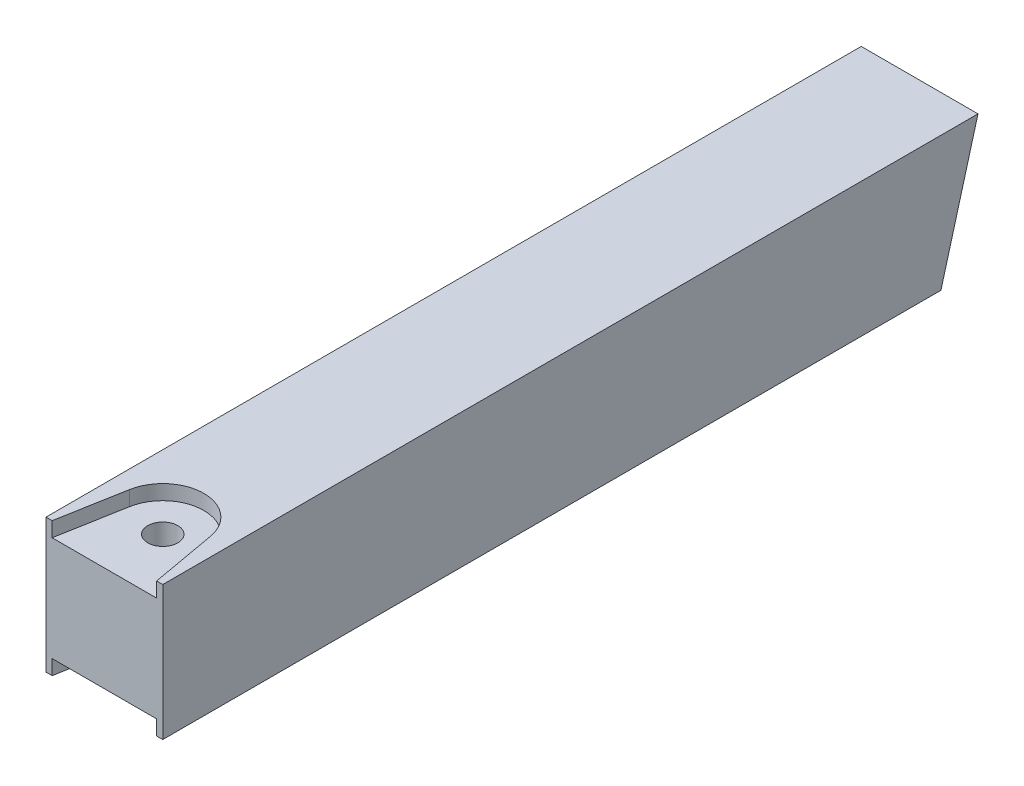
ISO-10303-21;
HEADER;
FILE_DESCRIPTION(('STEP AP214'),'2;1');
FILE_NAME('part.step','',(''),(''),'','','');
FILE_SCHEMA(('AUTOMOTIVE_DESIGN { 1 0 10303 214 1 1 1 1 }'));
ENDSEC;
DATA;
#1=APPLICATION_CONTEXT('core data for automotive mechanical design processes');
#2=APPLICATION_PROTOCOL_DEFINITION('international standard','automotive_design',2000,#1);
#3=PRODUCT_CONTEXT('',#1,'mechanical');
#4=PRODUCT('Part','Part','',(#3));
#5=PRODUCT_RELATED_PRODUCT_CATEGORY('part','',(#4));
#6=PRODUCT_DEFINITION_FORMATION('','',#4);
#7=PRODUCT_DEFINITION_CONTEXT('part definition',#1,'design');
#8=PRODUCT_DEFINITION('design','',#6,#7);
#9=PRODUCT_DEFINITION_SHAPE('','',#8);
#10=(LENGTH_UNIT() NAMED_UNIT(*) SI_UNIT(.MILLI.,.METRE.));
#11=(NAMED_UNIT(*) PLANE_ANGLE_UNIT() SI_UNIT($,.RADIAN.));
#12=(NAMED_UNIT(*) SI_UNIT($,.STERADIAN.) SOLID_ANGLE_UNIT());
#13=UNCERTAINTY_MEASURE_WITH_UNIT(LENGTH_MEASURE(1.E-05),#10,'distance_accuracy_value','');
#14=(GEOMETRIC_REPRESENTATION_CONTEXT(3) GLOBAL_UNCERTAINTY_ASSIGNED_CONTEXT((#13)) GLOBAL_UNIT_ASSIGNED_CONTEXT((#10,
#11,#12)) REPRESENTATION_CONTEXT('',''));
#15=CARTESIAN_POINT('',(0.,0.,0.));
#16=DIRECTION('',(0.,0.,1.));
#17=DIRECTION('',(1.,0.,0.));
#18=AXIS2_PLACEMENT_3D('',#15,#16,#17);
#19=CARTESIAN_POINT('',(0.,14.605,0.));
#20=DIRECTION('',(0.,-1.,0.));
#21=DIRECTION('',(0.,0.,-1.));
#22=AXIS2_PLACEMENT_3D('',#19,#20,#21);
#23=CYLINDRICAL_SURFACE('',#22,3.2639);
#24=CARTESIAN_POINT('',(0.,-11.3792,0.));
#25=DIRECTION('',(0.,1.,0.));
#26=DIRECTION('',(0.,0.,1.));
#27=AXIS2_PLACEMENT_3D('',#24,#25,#26);
#28=CIRCLE('',#27,3.2639);
#29=CARTESIAN_POINT('',(0.,-11.3792,-3.2639));
#30=VERTEX_POINT('',#29);
#31=EDGE_CURVE('E168',#30,#30,#28,.F.);
#32=CARTESIAN_POINT('',(0.,11.3792,0.));
#33=DIRECTION('',(0.,1.,0.));
#34=DIRECTION('',(0.,0.,1.));
#35=AXIS2_PLACEMENT_3D('',#32,#33,#34);
#36=CIRCLE('',#35,3.2639);
#37=CARTESIAN_POINT('',(0.,11.3792,-3.2639));
#38=VERTEX_POINT('',#37);
#39=EDGE_CURVE('E155',#38,#38,#36,.F.);
#40=CARTESIAN_POINT('',(0.,-11.3792,-3.2639));
#41=CARTESIAN_POINT('',(0.,-11.1421333333333,-3.2639));
#42=CARTESIAN_POINT('',(0.,-10.9050666666667,-3.2639));
#43=CARTESIAN_POINT('',(0.,-10.4309333333333,-3.2639));
#44=CARTESIAN_POINT('',(0.,-10.1938666666667,-3.2639));
#45=CARTESIAN_POINT('',(0.,-9.71973333333334,-3.2639));
#46=CARTESIAN_POINT('',(0.,-9.48266666666667,-3.2639));
#47=CARTESIAN_POINT('',(0.,-9.00853333333334,-3.2639));
#48=CARTESIAN_POINT('',(0.,-8.77146666666667,-3.2639));
#49=CARTESIAN_POINT('',(0.,-8.29733333333334,-3.2639));
#50=CARTESIAN_POINT('',(0.,-8.06026666666667,-3.2639));
#51=CARTESIAN_POINT('',(0.,-7.58613333333334,-3.2639));
#52=CARTESIAN_POINT('',(0.,-7.34906666666667,-3.2639));
#53=CARTESIAN_POINT('',(0.,-6.87493333333334,-3.2639));
#54=CARTESIAN_POINT('',(0.,-6.63786666666667,-3.2639));
#55=CARTESIAN_POINT('',(0.,-6.16373333333333,-3.2639));
#56=CARTESIAN_POINT('',(0.,-5.92666666666667,-3.2639));
#57=CARTESIAN_POINT('',(0.,-5.45253333333333,-3.2639));
#58=CARTESIAN_POINT('',(0.,-5.21546666666667,-3.2639));
#59=CARTESIAN_POINT('',(0.,-4.74133333333333,-3.2639));
#60=CARTESIAN_POINT('',(0.,-4.50426666666667,-3.2639));
#61=CARTESIAN_POINT('',(0.,-4.03013333333333,-3.2639));
#62=CARTESIAN_POINT('',(0.,-3.79306666666667,-3.2639));
#63=CARTESIAN_POINT('',(0.,-3.31893333333333,-3.2639));
#64=CARTESIAN_POINT('',(0.,-3.08186666666667,-3.2639));
#65=CARTESIAN_POINT('',(0.,-2.60773333333334,-3.2639));
#66=CARTESIAN_POINT('',(0.,-2.37066666666667,-3.2639));
#67=CARTESIAN_POINT('',(0.,-1.89653333333334,-3.2639));
#68=CARTESIAN_POINT('',(0.,-1.65946666666667,-3.2639));
#69=CARTESIAN_POINT('',(0.,-1.18533333333333,-3.2639));
#70=CARTESIAN_POINT('',(0.,-0.948266666666668,-3.2639));
#71=CARTESIAN_POINT('',(0.,-0.474133333333335,-3.2639));
#72=CARTESIAN_POINT('',(0.,-0.237066666666668,-3.2639));
#73=CARTESIAN_POINT('',(0.,0.237066666666665,-3.2639));
#74=CARTESIAN_POINT('',(0.,0.474133333333332,-3.2639));
#75=CARTESIAN_POINT('',(0.,0.948266666666665,-3.2639));
#76=CARTESIAN_POINT('',(0.,1.18533333333333,-3.2639));
#77=CARTESIAN_POINT('',(0.,1.65946666666667,-3.2639));
#78=CARTESIAN_POINT('',(0.,1.89653333333333,-3.2639));
#79=CARTESIAN_POINT('',(0.,2.37066666666667,-3.2639));
#80=CARTESIAN_POINT('',(0.,2.60773333333333,-3.2639));
#81=CARTESIAN_POINT('',(0.,3.08186666666667,-3.2639));
#82=CARTESIAN_POINT('',(0.,3.31893333333333,-3.2639));
#83=CARTESIAN_POINT('',(0.,3.79306666666667,-3.2639));
#84=CARTESIAN_POINT('',(0.,4.03013333333333,-3.2639));
#85=CARTESIAN_POINT('',(0.,4.50426666666667,-3.2639));
#86=CARTESIAN_POINT('',(0.,4.74133333333333,-3.2639));
#87=CARTESIAN_POINT('',(0.,5.21546666666667,-3.2639));
#88=CARTESIAN_POINT('',(0.,5.45253333333333,-3.2639));
#89=CARTESIAN_POINT('',(0.,5.92666666666666,-3.2639));
#90=CARTESIAN_POINT('',(0.,6.16373333333333,-3.2639));
#91=CARTESIAN_POINT('',(0.,6.63786666666667,-3.2639));
#92=CARTESIAN_POINT('',(0.,6.87493333333333,-3.2639));
#93=CARTESIAN_POINT('',(0.,7.34906666666666,-3.2639));
#94=CARTESIAN_POINT('',(0.,7.58613333333333,-3.2639));
#95=CARTESIAN_POINT('',(0.,8.06026666666667,-3.2639));
#96=CARTESIAN_POINT('',(0.,8.29733333333333,-3.2639));
#97=CARTESIAN_POINT('',(0.,8.77146666666667,-3.2639));
#98=CARTESIAN_POINT('',(0.,9.00853333333333,-3.2639));
#99=CARTESIAN_POINT('',(0.,9.48266666666667,-3.2639));
#100=CARTESIAN_POINT('',(0.,9.71973333333333,-3.2639));
#101=CARTESIAN_POINT('',(0.,10.1938666666667,-3.2639));
#102=CARTESIAN_POINT('',(0.,10.4309333333333,-3.2639));
#103=CARTESIAN_POINT('',(0.,10.9050666666667,-3.2639));
#104=CARTESIAN_POINT('',(0.,11.1421333333333,-3.2639));
#105=CARTESIAN_POINT('',(0.,11.3792,-3.2639));
#106=B_SPLINE_CURVE_WITH_KNOTS('',3,(#40,#41,#42,#43,#44,#45,#46,#47,#48,#49,#50,#51,#52,#53,
#54,#55,#56,#57,#58,#59,#60,#61,#62,#63,#64,#65,#66,#67,#68,#69,#70,#71,#72,#73,#74,#75,#76,#77,
#78,#79,#80,#81,#82,#83,#84,#85,#86,#87,#88,#89,#90,#91,#92,#93,#94,#95,#96,#97,#98,#99,#100,
#101,#102,#103,#104,#105),.UNSPECIFIED.,.F.,.F.,(4,2,2,2,2,2,2,2,2,2,2,2,2,2,2,2,2,2,2,2,2,2,2,
2,2,2,2,2,2,2,2,2,4),(0.,0.711199999999999,1.4224,2.1336,2.8448,3.556,4.2672,4.9784,5.6896,
6.4008,7.112,7.8232,8.5344,9.2456,9.9568,10.668,11.3792,12.0904,12.8016,13.5128,14.224,14.9352,
15.6464,16.3576,17.0688,17.78,18.4912,19.2024,19.9136,20.6248,21.336,22.0472,22.7584),.UNSPECIFIED.);
#107=EDGE_CURVE('BSEAM41',#30,#38,#106,.T.);
#108=ORIENTED_EDGE('',*,*,#31,.T.);
#109=ORIENTED_EDGE('',*,*,#39,.F.);
#110=ORIENTED_EDGE('',*,*,#107,.T.);
#111=ORIENTED_EDGE('',*,*,#107,.F.);
#112=EDGE_LOOP('',(#108,#110,#109,#111));
#113=FACE_BOUND('',#112,.T.);
#114=ADVANCED_FACE('F41',(#113),#23,.F.);
#115=CARTESIAN_POINT('',(-12.7,-14.605,-200.03366515423));
#116=DIRECTION('',(0.,-1.,0.));
#117=DIRECTION('',(0.,0.,-1.));
#118=AXIS2_PLACEMENT_3D('',#115,#116,#117);
#119=PLANE('',#118);
#120=CARTESIAN_POINT('',(0.,-14.605,0.));
#121=DIRECTION('',(0.,-1.,0.));
#122=DIRECTION('',(0.,0.,-1.));
#123=AXIS2_PLACEMENT_3D('',#120,#121,#122);
#124=CIRCLE('',#123,8.9408);
#125=CARTESIAN_POINT('',(-8.7999993450147,-14.605,-1.58047972708946));
#126=VERTEX_POINT('',#125);
#127=CARTESIAN_POINT('',(8.7999993450147,-14.605,-1.58047972708946));
#128=VERTEX_POINT('',#127);
#129=EDGE_CURVE('E235',#126,#128,#124,.T.);
#130=ORIENTED_EDGE('',*,*,#129,.F.);
#131=DIRECTION('',(-0.176771623019133,0.,0.984251895245918));
#132=VECTOR('',#131,1.);
#133=CARTESIAN_POINT('',(25.6065667525787,-14.605,-193.153806441383));
#134=LINE('',#133,#132);
#135=CARTESIAN_POINT('',(-11.3647732520222,-14.605,12.7));
#136=VERTEX_POINT('',#135);
#137=EDGE_CURVE('E177',#126,#136,#134,.T.);
#138=ORIENTED_EDGE('',*,*,#137,.T.);
#139=DIRECTION('',(1.,0.,0.));
#140=VECTOR('',#139,1.);
#141=CARTESIAN_POINT('',(-12.7,-14.605,12.7));
#142=LINE('',#141,#140);
#143=CARTESIAN_POINT('',(-12.7,-14.605,12.7));
#144=VERTEX_POINT('',#143);
#145=EDGE_CURVE('E203',#144,#136,#142,.T.);
#146=ORIENTED_EDGE('',*,*,#145,.F.);
#147=DIRECTION('',(0.,0.,1.));
#148=VECTOR('',#147,1.);
#149=CARTESIAN_POINT('',(-12.7,-14.605,-200.03366515423));
#150=LINE('',#149,#148);
#151=CARTESIAN_POINT('',(-12.7,-14.605,-156.56858645989));
#152=VERTEX_POINT('',#151);
#153=EDGE_CURVE('E218',#152,#144,#150,.T.);
#154=ORIENTED_EDGE('',*,*,#153,.F.);
#155=DIRECTION('',(1.,0.,0.));
#156=VECTOR('',#155,1.);
#157=CARTESIAN_POINT('',(-12.7,-14.605,-156.56858645989));
#158=LINE('',#157,#156);
#159=CARTESIAN_POINT('',(12.7,-14.605,-156.56858645989));
#160=VERTEX_POINT('',#159);
#161=EDGE_CURVE('E215',#152,#160,#158,.T.);
#162=ORIENTED_EDGE('',*,*,#161,.T.);
#163=DIRECTION('',(0.,0.,1.));
#164=VECTOR('',#163,1.);
#165=CARTESIAN_POINT('',(12.7,-14.605,-200.03366515423));
#166=LINE('',#165,#164);
#167=CARTESIAN_POINT('',(12.7,-14.605,12.7));
#168=VERTEX_POINT('',#167);
#169=EDGE_CURVE('E214',#160,#168,#166,.T.);
#170=ORIENTED_EDGE('',*,*,#169,.T.);
#171=CARTESIAN_POINT('',(11.3647732520222,-14.605,12.7));
#172=VERTEX_POINT('',#171);
#173=EDGE_CURVE('E202',#172,#168,#142,.T.);
#174=ORIENTED_EDGE('',*,*,#173,.F.);
#175=DIRECTION('',(0.176771623019133,0.,0.984251895245918));
#176=VECTOR('',#175,1.);
#177=CARTESIAN_POINT('',(-26.4002712028811,-14.605,-197.573096687933));
#178=LINE('',#177,#176);
#179=EDGE_CURVE('E175',#128,#172,#178,.T.);
#180=ORIENTED_EDGE('',*,*,#179,.F.);
#181=EDGE_LOOP('',(#130,#138,#146,#154,#162,#170,#174,#180));
#182=FACE_BOUND('',#181,.T.);
#183=ADVANCED_FACE('F263',(#182),#119,.T.);
#184=CARTESIAN_POINT('',(0.,0.,12.7));
#185=DIRECTION('',(0.,0.,-1.));
#186=DIRECTION('',(-1.,0.,0.));
#187=AXIS2_PLACEMENT_3D('',#184,#185,#186);
#188=PLANE('',#187);
#189=DIRECTION('',(1.,0.,0.));
#190=VECTOR('',#189,1.);
#191=CARTESIAN_POINT('',(0.,11.3792,12.7));
#192=LINE('',#191,#190);
#193=CARTESIAN_POINT('',(-11.3647732520222,11.3792,12.7));
#194=VERTEX_POINT('',#193);
#195=CARTESIAN_POINT('',(11.3647732520222,11.3792,12.7));
#196=VERTEX_POINT('',#195);
#197=EDGE_CURVE('E146',#194,#196,#192,.T.);
#198=ORIENTED_EDGE('',*,*,#197,.F.);
#199=DIRECTION('',(0.,1.,0.));
#200=VECTOR('',#199,1.);
#201=CARTESIAN_POINT('',(-11.3647732520222,0.,12.7));
#202=LINE('',#201,#200);
#203=CARTESIAN_POINT('',(-11.3647732520222,14.605,12.7));
#204=VERTEX_POINT('',#203);
#205=EDGE_CURVE('E158',#194,#204,#202,.T.);
#206=ORIENTED_EDGE('',*,*,#205,.T.);
#207=DIRECTION('',(-1.,0.,0.));
#208=VECTOR('',#207,1.);
#209=CARTESIAN_POINT('',(-12.7,14.605,12.7));
#210=LINE('',#209,#208);
#211=CARTESIAN_POINT('',(-12.7,14.605,12.7));
#212=VERTEX_POINT('',#211);
#213=EDGE_CURVE('E195',#204,#212,#210,.T.);
#214=ORIENTED_EDGE('',*,*,#213,.T.);
#215=DIRECTION('',(0.,-1.,0.));
#216=VECTOR('',#215,1.);
#217=CARTESIAN_POINT('',(-12.7,-14.605,12.7));
#218=LINE('',#217,#216);
#219=EDGE_CURVE('E199',#212,#144,#218,.T.);
#220=ORIENTED_EDGE('',*,*,#219,.T.);
#221=ORIENTED_EDGE('',*,*,#145,.T.);
#222=DIRECTION('',(0.,-1.,0.));
#223=VECTOR('',#222,1.);
#224=CARTESIAN_POINT('',(-11.3647732520222,0.,12.7));
#225=LINE('',#224,#223);
#226=CARTESIAN_POINT('',(-11.3647732520222,-11.3792,12.7));
#227=VERTEX_POINT('',#226);
#228=EDGE_CURVE('E233',#227,#136,#225,.T.);
#229=ORIENTED_EDGE('',*,*,#228,.F.);
#230=DIRECTION('',(1.,0.,0.));
#231=VECTOR('',#230,1.);
#232=CARTESIAN_POINT('',(0.,-11.3792,12.7));
#233=LINE('',#232,#231);
#234=CARTESIAN_POINT('',(11.3647732520222,-11.3792,12.7));
#235=VERTEX_POINT('',#234);
#236=EDGE_CURVE('E172',#227,#235,#233,.T.);
#237=ORIENTED_EDGE('',*,*,#236,.T.);
#238=DIRECTION('',(0.,-1.,0.));
#239=VECTOR('',#238,1.);
#240=CARTESIAN_POINT('',(11.3647732520222,0.,12.7));
#241=LINE('',#240,#239);
#242=EDGE_CURVE('E228',#235,#172,#241,.T.);
#243=ORIENTED_EDGE('',*,*,#242,.T.);
#244=ORIENTED_EDGE('',*,*,#173,.T.);
#245=DIRECTION('',(0.,1.,0.));
#246=VECTOR('',#245,1.);
#247=CARTESIAN_POINT('',(12.7,-14.605,12.7));
#248=LINE('',#247,#246);
#249=CARTESIAN_POINT('',(12.7,14.605,12.7));
#250=VERTEX_POINT('',#249);
#251=EDGE_CURVE('E184',#168,#250,#248,.T.);
#252=ORIENTED_EDGE('',*,*,#251,.T.);
#253=CARTESIAN_POINT('',(11.3647732520222,14.605,12.7));
#254=VERTEX_POINT('',#253);
#255=EDGE_CURVE('E196',#250,#254,#210,.T.);
#256=ORIENTED_EDGE('',*,*,#255,.T.);
#257=DIRECTION('',(0.,1.,0.));
#258=VECTOR('',#257,1.);
#259=CARTESIAN_POINT('',(11.3647732520222,0.,12.7));
#260=LINE('',#259,#258);
#261=EDGE_CURVE('E56',#196,#254,#260,.T.);
#262=ORIENTED_EDGE('',*,*,#261,.F.);
#263=EDGE_LOOP('',(#198,#206,#214,#220,#221,#229,#237,#243,#244,#252,#256,#262));
#264=FACE_BOUND('',#263,.T.);
#265=ADVANCED_FACE('F247',(#264),#188,.F.);
#266=CARTESIAN_POINT('',(-233.303265585855,-866.048105190081,78.4937864077664));
#267=DIRECTION('',(0.,-0.266119959453495,-0.963939918864485));
#268=DIRECTION('',(0.,0.963939918864485,-0.266119959453495));
#269=AXIS2_PLACEMENT_3D('',#266,#267,#268);
#270=PLANE('',#269);
#271=CARTESIAN_POINT('',(6.35,-8.48398151521052,-158.258448202419));
#272=DIRECTION('',(0.,-0.266119959453495,-0.963939918864485));
#273=DIRECTION('',(0.,0.963939918864485,-0.266119959453495));
#274=AXIS2_PLACEMENT_3D('',#271,#272,#273);
#275=CIRCLE('',#274,2.52730000000013);
#276=CARTESIAN_POINT('',(6.35,-6.04781615826419,-158.931013175946));
#277=VERTEX_POINT('',#276);
#278=EDGE_CURVE('E185',#277,#277,#275,.T.);
#279=ORIENTED_EDGE('',*,*,#278,.F.);
#280=EDGE_LOOP('',(#279));
#281=FACE_BOUND('',#280,.T.);
#282=CARTESIAN_POINT('',(-6.35,6.81856469676318,-162.483102558744));
#283=DIRECTION('',(0.,-0.266119959453495,-0.963939918864485));
#284=DIRECTION('',(0.,0.963939918864485,-0.266119959453495));
#285=AXIS2_PLACEMENT_3D('',#282,#283,#284);
#286=CIRCLE('',#285,2.52730000000013);
#287=CARTESIAN_POINT('',(-6.35,9.25473005370952,-163.155667532271));
#288=VERTEX_POINT('',#287);
#289=EDGE_CURVE('E188',#288,#288,#286,.T.);
#290=ORIENTED_EDGE('',*,*,#289,.F.);
#291=EDGE_LOOP('',(#290));
#292=FACE_BOUND('',#291,.T.);
#293=DIRECTION('',(0.,0.963939918864485,-0.266119959453495));
#294=VECTOR('',#293,1.);
#295=CARTESIAN_POINT('',(12.7,-3.4551792734784,-159.646776066511));
#296=LINE('',#295,#294);
#297=CARTESIAN_POINT('',(12.7,14.605,-164.632744675055));
#298=VERTEX_POINT('',#297);
#299=EDGE_CURVE('E210',#160,#298,#296,.T.);
#300=ORIENTED_EDGE('',*,*,#299,.F.);
#301=ORIENTED_EDGE('',*,*,#161,.F.);
#302=DIRECTION('',(0.,-0.963939918864485,0.266119959453495));
#303=VECTOR('',#302,1.);
#304=CARTESIAN_POINT('',(-12.7,-3.4551792734784,-159.646776066511));
#305=LINE('',#304,#303);
#306=CARTESIAN_POINT('',(-12.7,14.605,-164.632744675055));
#307=VERTEX_POINT('',#306);
#308=EDGE_CURVE('E219',#307,#152,#305,.T.);
#309=ORIENTED_EDGE('',*,*,#308,.F.);
#310=DIRECTION('',(-1.,0.,0.));
#311=VECTOR('',#310,1.);
#312=CARTESIAN_POINT('',(-12.7,14.605,-164.632744675055));
#313=LINE('',#312,#311);
#314=EDGE_CURVE('E206',#298,#307,#313,.T.);
#315=ORIENTED_EDGE('',*,*,#314,.F.);
#316=EDGE_LOOP('',(#300,#301,#309,#315));
#317=FACE_BOUND('',#316,.T.);
#318=ADVANCED_FACE('F43',(#281,#292,#317),#270,.T.);
#319=CARTESIAN_POINT('',(-12.7,14.605,-200.03366515423));
#320=DIRECTION('',(0.,1.,0.));
#321=DIRECTION('',(0.,0.,1.));
#322=AXIS2_PLACEMENT_3D('',#319,#320,#321);
#323=PLANE('',#322);
#324=DIRECTION('',(-0.176771623019133,0.,0.984251895245918));
#325=VECTOR('',#324,1.);
#326=CARTESIAN_POINT('',(25.6065667525787,14.605,-193.153806441383));
#327=LINE('',#326,#325);
#328=CARTESIAN_POINT('',(-8.7999993450147,14.605,-1.58047972708946));
#329=VERTEX_POINT('',#328);
#330=EDGE_CURVE('E11',#329,#204,#327,.T.);
#331=ORIENTED_EDGE('',*,*,#330,.F.);
#332=CARTESIAN_POINT('',(0.,14.605,0.));
#333=DIRECTION('',(0.,1.,0.));
#334=DIRECTION('',(0.,0.,1.));
#335=AXIS2_PLACEMENT_3D('',#332,#333,#334);
#336=CIRCLE('',#335,8.9408);
#337=CARTESIAN_POINT('',(8.7999993450147,14.605,-1.58047972708946));
#338=VERTEX_POINT('',#337);
#339=EDGE_CURVE('E49',#329,#338,#336,.F.);
#340=ORIENTED_EDGE('',*,*,#339,.T.);
#341=DIRECTION('',(0.176771623019133,0.,0.984251895245918));
#342=VECTOR('',#341,1.);
#343=CARTESIAN_POINT('',(-26.4002712028811,14.605,-197.573096687933));
#344=LINE('',#343,#342);
#345=EDGE_CURVE('E133',#338,#254,#344,.T.);
#346=ORIENTED_EDGE('',*,*,#345,.T.);
#347=ORIENTED_EDGE('',*,*,#255,.F.);
#348=DIRECTION('',(0.,0.,1.));
#349=VECTOR('',#348,1.);
#350=CARTESIAN_POINT('',(12.7,14.605,-200.03366515423));
#351=LINE('',#350,#349);
#352=EDGE_CURVE('E213',#298,#250,#351,.T.);
#353=ORIENTED_EDGE('',*,*,#352,.F.);
#354=ORIENTED_EDGE('',*,*,#314,.T.);
#355=DIRECTION('',(0.,0.,1.));
#356=VECTOR('',#355,1.);
#357=CARTESIAN_POINT('',(-12.7,14.605,-200.03366515423));
#358=LINE('',#357,#356);
#359=EDGE_CURVE('E209',#307,#212,#358,.T.);
#360=ORIENTED_EDGE('',*,*,#359,.T.);
#361=ORIENTED_EDGE('',*,*,#213,.F.);
#362=EDGE_LOOP('',(#331,#340,#346,#347,#353,#354,#360,#361));
#363=FACE_BOUND('',#362,.T.);
#364=ADVANCED_FACE('F241',(#363),#323,.T.);
#365=CARTESIAN_POINT('',(-12.7,-14.605,-200.03366515423));
#366=DIRECTION('',(-1.,0.,0.));
#367=DIRECTION('',(0.,0.,1.));
#368=AXIS2_PLACEMENT_3D('',#365,#366,#367);
#369=PLANE('',#368);
#370=ORIENTED_EDGE('',*,*,#359,.F.);
#371=ORIENTED_EDGE('',*,*,#308,.T.);
#372=ORIENTED_EDGE('',*,*,#153,.T.);
#373=ORIENTED_EDGE('',*,*,#219,.F.);
#374=EDGE_LOOP('',(#370,#371,#372,#373));
#375=FACE_BOUND('',#374,.T.);
#376=ADVANCED_FACE('F258',(#375),#369,.T.);
#377=CARTESIAN_POINT('',(12.7,-14.605,-200.03366515423));
#378=DIRECTION('',(1.,0.,0.));
#379=DIRECTION('',(0.,0.,-1.));
#380=AXIS2_PLACEMENT_3D('',#377,#378,#379);
#381=PLANE('',#380);
#382=ORIENTED_EDGE('',*,*,#169,.F.);
#383=ORIENTED_EDGE('',*,*,#299,.T.);
#384=ORIENTED_EDGE('',*,*,#352,.T.);
#385=ORIENTED_EDGE('',*,*,#251,.F.);
#386=EDGE_LOOP('',(#382,#383,#384,#385));
#387=FACE_BOUND('',#386,.T.);
#388=ADVANCED_FACE('F252',(#387),#381,.T.);
#389=CARTESIAN_POINT('',(-6.35000000000001,11.0432190530874,-147.18055634677));
#390=DIRECTION('',(0.,-0.266119959453495,-0.963939918864485));
#391=DIRECTION('',(0.,0.963939918864485,-0.266119959453495));
#392=AXIS2_PLACEMENT_3D('',#389,#390,#391);
#393=CYLINDRICAL_SURFACE('',#392,2.52730000000013);
#394=CARTESIAN_POINT('',(-6.35000000000001,11.0432190530874,-147.18055634677));
#395=DIRECTION('',(0.,-0.266119959453495,-0.963939918864485));
#396=DIRECTION('',(0.,0.963939918864485,-0.266119959453495));
#397=AXIS2_PLACEMENT_3D('',#394,#395,#396);
#398=CIRCLE('',#397,2.52730000000013);
#399=CARTESIAN_POINT('',(-6.35000000000001,13.4793844100337,-147.853121320297));
#400=VERTEX_POINT('',#399);
#401=EDGE_CURVE('E180',#400,#400,#398,.T.);
#402=ORIENTED_EDGE('',*,*,#401,.F.);
#403=EDGE_LOOP('',(#402));
#404=FACE_BOUND('',#403,.T.);
#405=ORIENTED_EDGE('',*,*,#289,.T.);
#406=EDGE_LOOP('',(#405));
#407=FACE_BOUND('',#406,.T.);
#408=ADVANCED_FACE('F303',(#404,#407),#393,.F.);
#409=CARTESIAN_POINT('',(-6.35000000000001,11.0432190530874,-147.18055634677));
#410=DIRECTION('',(0.,-0.266119959453495,-0.963939918864485));
#411=DIRECTION('',(0.,0.963939918864485,-0.266119959453495));
#412=AXIS2_PLACEMENT_3D('',#409,#410,#411);
#413=PLANE('',#412);
#414=ORIENTED_EDGE('',*,*,#401,.T.);
#415=EDGE_LOOP('',(#414));
#416=FACE_BOUND('',#415,.T.);
#417=ADVANCED_FACE('F301',(#416),#413,.T.);
#418=CARTESIAN_POINT('',(6.34999999999999,-4.2593271588863,-142.955901990446));
#419=DIRECTION('',(0.,-0.266119959453495,-0.963939918864485));
#420=DIRECTION('',(0.,0.963939918864485,-0.266119959453495));
#421=AXIS2_PLACEMENT_3D('',#418,#419,#420);
#422=CYLINDRICAL_SURFACE('',#421,2.52730000000013);
#423=CARTESIAN_POINT('',(6.34999999999999,-4.2593271588863,-142.955901990446));
#424=DIRECTION('',(0.,-0.266119959453495,-0.963939918864485));
#425=DIRECTION('',(0.,0.963939918864485,-0.266119959453495));
#426=AXIS2_PLACEMENT_3D('',#423,#424,#425);
#427=CIRCLE('',#426,2.52730000000013);
#428=CARTESIAN_POINT('',(6.34999999999999,-1.82316180193996,-143.628466963973));
#429=VERTEX_POINT('',#428);
#430=EDGE_CURVE('E181',#429,#429,#427,.T.);
#431=ORIENTED_EDGE('',*,*,#430,.F.);
#432=EDGE_LOOP('',(#431));
#433=FACE_BOUND('',#432,.T.);
#434=ORIENTED_EDGE('',*,*,#278,.T.);
#435=EDGE_LOOP('',(#434));
#436=FACE_BOUND('',#435,.T.);
#437=ADVANCED_FACE('F297',(#433,#436),#422,.F.);
#438=CARTESIAN_POINT('',(6.34999999999999,-4.2593271588863,-142.955901990446));
#439=DIRECTION('',(0.,-0.266119959453495,-0.963939918864485));
#440=DIRECTION('',(0.,0.963939918864485,-0.266119959453495));
#441=AXIS2_PLACEMENT_3D('',#438,#439,#440);
#442=PLANE('',#441);
#443=ORIENTED_EDGE('',*,*,#430,.T.);
#444=EDGE_LOOP('',(#443));
#445=FACE_BOUND('',#444,.T.);
#446=ADVANCED_FACE('F295',(#445),#442,.T.);
#447=CARTESIAN_POINT('',(0.,-11.3792,0.));
#448=DIRECTION('',(0.,1.,0.));
#449=DIRECTION('',(0.,0.,-1.));
#450=AXIS2_PLACEMENT_3D('',#447,#448,#449);
#451=PLANE('',#450);
#452=ORIENTED_EDGE('',*,*,#31,.F.);
#453=EDGE_LOOP('',(#452));
#454=FACE_BOUND('',#453,.T.);
#455=DIRECTION('',(-0.176771623019133,0.,0.984251895245918));
#456=VECTOR('',#455,1.);
#457=CARTESIAN_POINT('',(-8.7999993450147,-11.3792,-1.58047972708946));
#458=LINE('',#457,#456);
#459=CARTESIAN_POINT('',(-8.7999993450147,-11.3792,-1.58047972708946));
#460=VERTEX_POINT('',#459);
#461=EDGE_CURVE('E164',#460,#227,#458,.T.);
#462=ORIENTED_EDGE('',*,*,#461,.F.);
#463=CARTESIAN_POINT('',(0.,-11.3792,0.));
#464=DIRECTION('',(0.,1.,0.));
#465=DIRECTION('',(0.,0.,1.));
#466=AXIS2_PLACEMENT_3D('',#463,#464,#465);
#467=CIRCLE('',#466,8.9408);
#468=CARTESIAN_POINT('',(8.7999993450147,-11.3792,-1.58047972708946));
#469=VERTEX_POINT('',#468);
#470=EDGE_CURVE('E166',#460,#469,#467,.F.);
#471=ORIENTED_EDGE('',*,*,#470,.T.);
#472=DIRECTION('',(0.176771623019133,0.,0.984251895245918));
#473=VECTOR('',#472,1.);
#474=CARTESIAN_POINT('',(8.7999993450147,-11.3792,-1.58047972708946));
#475=LINE('',#474,#473);
#476=EDGE_CURVE('E64',#469,#235,#475,.T.);
#477=ORIENTED_EDGE('',*,*,#476,.T.);
#478=ORIENTED_EDGE('',*,*,#236,.F.);
#479=EDGE_LOOP('',(#462,#471,#477,#478));
#480=FACE_BOUND('',#479,.T.);
#481=ADVANCED_FACE('F273',(#454,#480),#451,.F.);
#482=CARTESIAN_POINT('',(-8.7999993450147,-14.605,-1.58047972708946));
#483=DIRECTION('',(0.984251895245918,0.,0.176771623019133));
#484=DIRECTION('',(-0.176771623019133,0.,0.984251895245918));
#485=AXIS2_PLACEMENT_3D('',#482,#483,#484);
#486=PLANE('',#485);
#487=DIRECTION('',(0.,1.,0.));
#488=VECTOR('',#487,1.);
#489=CARTESIAN_POINT('',(-8.7999993450147,-14.605,-1.58047972708946));
#490=LINE('',#489,#488);
#491=EDGE_CURVE('E161',#126,#460,#490,.T.);
#492=ORIENTED_EDGE('',*,*,#491,.T.);
#493=ORIENTED_EDGE('',*,*,#461,.T.);
#494=ORIENTED_EDGE('',*,*,#228,.T.);
#495=ORIENTED_EDGE('',*,*,#137,.F.);
#496=EDGE_LOOP('',(#492,#493,#494,#495));
#497=FACE_BOUND('',#496,.T.);
#498=ADVANCED_FACE('F267',(#497),#486,.T.);
#499=CARTESIAN_POINT('',(8.7999993450147,-14.605,-1.58047972708946));
#500=DIRECTION('',(0.984251895245918,0.,-0.176771623019133));
#501=DIRECTION('',(0.176771623019133,0.,0.984251895245918));
#502=AXIS2_PLACEMENT_3D('',#499,#500,#501);
#503=PLANE('',#502);
#504=ORIENTED_EDGE('',*,*,#179,.T.);
#505=ORIENTED_EDGE('',*,*,#242,.F.);
#506=ORIENTED_EDGE('',*,*,#476,.F.);
#507=DIRECTION('',(0.,-1.,0.));
#508=VECTOR('',#507,1.);
#509=CARTESIAN_POINT('',(8.7999993450147,-14.605,-1.58047972708946));
#510=LINE('',#509,#508);
#511=EDGE_CURVE('E162',#128,#469,#510,.F.);
#512=ORIENTED_EDGE('',*,*,#511,.F.);
#513=EDGE_LOOP('',(#504,#505,#506,#512));
#514=FACE_BOUND('',#513,.T.);
#515=ADVANCED_FACE('F276',(#514),#503,.F.);
#516=CARTESIAN_POINT('',(0.,-14.605,0.));
#517=DIRECTION('',(0.,1.,0.));
#518=DIRECTION('',(0.,0.,-1.));
#519=AXIS2_PLACEMENT_3D('',#516,#517,#518);
#520=CYLINDRICAL_SURFACE('',#519,8.9408);
#521=ORIENTED_EDGE('',*,*,#129,.T.);
#522=ORIENTED_EDGE('',*,*,#511,.T.);
#523=ORIENTED_EDGE('',*,*,#470,.F.);
#524=ORIENTED_EDGE('',*,*,#491,.F.);
#525=EDGE_LOOP('',(#521,#522,#523,#524));
#526=FACE_BOUND('',#525,.T.);
#527=ADVANCED_FACE('F270',(#526),#520,.F.);
#528=CARTESIAN_POINT('',(-8.7999993450147,14.605,-1.58047972708946));
#529=DIRECTION('',(-0.984251895245918,0.,-0.176771623019133));
#530=DIRECTION('',(0.176771623019133,0.,-0.984251895245918));
#531=AXIS2_PLACEMENT_3D('',#528,#529,#530);
#532=PLANE('',#531);
#533=DIRECTION('',(-0.176771623019133,0.,0.984251895245918));
#534=VECTOR('',#533,1.);
#535=CARTESIAN_POINT('',(-8.7999993450147,11.3792,-1.58047972708946));
#536=LINE('',#535,#534);
#537=CARTESIAN_POINT('',(-8.7999993450147,11.3792,-1.58047972708946));
#538=VERTEX_POINT('',#537);
#539=EDGE_CURVE('E147',#538,#194,#536,.T.);
#540=ORIENTED_EDGE('',*,*,#539,.F.);
#541=DIRECTION('',(0.,-1.,0.));
#542=VECTOR('',#541,1.);
#543=CARTESIAN_POINT('',(-8.7999993450147,14.605,-1.58047972708946));
#544=LINE('',#543,#542);
#545=EDGE_CURVE('E137',#329,#538,#544,.T.);
#546=ORIENTED_EDGE('',*,*,#545,.F.);
#547=ORIENTED_EDGE('',*,*,#330,.T.);
#548=ORIENTED_EDGE('',*,*,#205,.F.);
#549=EDGE_LOOP('',(#540,#546,#547,#548));
#550=FACE_BOUND('',#549,.T.);
#551=ADVANCED_FACE('F245',(#550),#532,.F.);
#552=CARTESIAN_POINT('',(8.7999993450147,14.605,-1.58047972708946));
#553=DIRECTION('',(-0.984251895245918,0.,0.176771623019133));
#554=DIRECTION('',(-0.176771623019133,0.,-0.984251895245918));
#555=AXIS2_PLACEMENT_3D('',#552,#553,#554);
#556=PLANE('',#555);
#557=ORIENTED_EDGE('',*,*,#261,.T.);
#558=ORIENTED_EDGE('',*,*,#345,.F.);
#559=DIRECTION('',(0.,-1.,0.));
#560=VECTOR('',#559,1.);
#561=CARTESIAN_POINT('',(8.7999993450147,14.605,-1.58047972708946));
#562=LINE('',#561,#560);
#563=CARTESIAN_POINT('',(8.7999993450147,11.3792,-1.58047972708946));
#564=VERTEX_POINT('',#563);
#565=EDGE_CURVE('E129',#338,#564,#562,.T.);
#566=ORIENTED_EDGE('',*,*,#565,.T.);
#567=DIRECTION('',(0.176771623019133,0.,0.984251895245918));
#568=VECTOR('',#567,1.);
#569=CARTESIAN_POINT('',(8.7999993450147,11.3792,-1.58047972708946));
#570=LINE('',#569,#568);
#571=EDGE_CURVE('E132',#564,#196,#570,.T.);
#572=ORIENTED_EDGE('',*,*,#571,.T.);
#573=EDGE_LOOP('',(#557,#558,#566,#572));
#574=FACE_BOUND('',#573,.T.);
#575=ADVANCED_FACE('F131',(#574),#556,.T.);
#576=CARTESIAN_POINT('',(0.,11.3792,0.));
#577=DIRECTION('',(0.,1.,0.));
#578=DIRECTION('',(0.,0.,-1.));
#579=AXIS2_PLACEMENT_3D('',#576,#577,#578);
#580=PLANE('',#579);
#581=ORIENTED_EDGE('',*,*,#39,.T.);
#582=EDGE_LOOP('',(#581));
#583=FACE_BOUND('',#582,.T.);
#584=ORIENTED_EDGE('',*,*,#197,.T.);
#585=ORIENTED_EDGE('',*,*,#571,.F.);
#586=CARTESIAN_POINT('',(0.,11.3792,0.));
#587=DIRECTION('',(0.,1.,0.));
#588=DIRECTION('',(0.,0.,1.));
#589=AXIS2_PLACEMENT_3D('',#586,#587,#588);
#590=CIRCLE('',#589,8.9408);
#591=EDGE_CURVE('E143',#538,#564,#590,.F.);
#592=ORIENTED_EDGE('',*,*,#591,.F.);
#593=ORIENTED_EDGE('',*,*,#539,.T.);
#594=EDGE_LOOP('',(#584,#585,#592,#593));
#595=FACE_BOUND('',#594,.T.);
#596=ADVANCED_FACE('F141',(#583,#595),#580,.T.);
#597=CARTESIAN_POINT('',(0.,14.605,0.));
#598=DIRECTION('',(0.,-1.,0.));
#599=DIRECTION('',(0.,0.,1.));
#600=AXIS2_PLACEMENT_3D('',#597,#598,#599);
#601=CYLINDRICAL_SURFACE('',#600,8.9408);
#602=ORIENTED_EDGE('',*,*,#545,.T.);
#603=ORIENTED_EDGE('',*,*,#591,.T.);
#604=ORIENTED_EDGE('',*,*,#565,.F.);
#605=ORIENTED_EDGE('',*,*,#339,.F.);
#606=EDGE_LOOP('',(#602,#603,#604,#605));
#607=FACE_BOUND('',#606,.T.);
#608=ADVANCED_FACE('F149',(#607),#601,.F.);
#609=CLOSED_SHELL('',(#114,#183,#265,#318,#364,#376,#388,#408,#417,#437,#446,#481,#498,#515,
#527,#551,#575,#596,#608));
#610=MANIFOLD_SOLID_BREP('B2',#609);
#611=ADVANCED_BREP_SHAPE_REPRESENTATION('',(#18,#610),#14);
#612=SHAPE_DEFINITION_REPRESENTATION(#9,#611);
ENDSEC;
END-ISO-10303-21;
